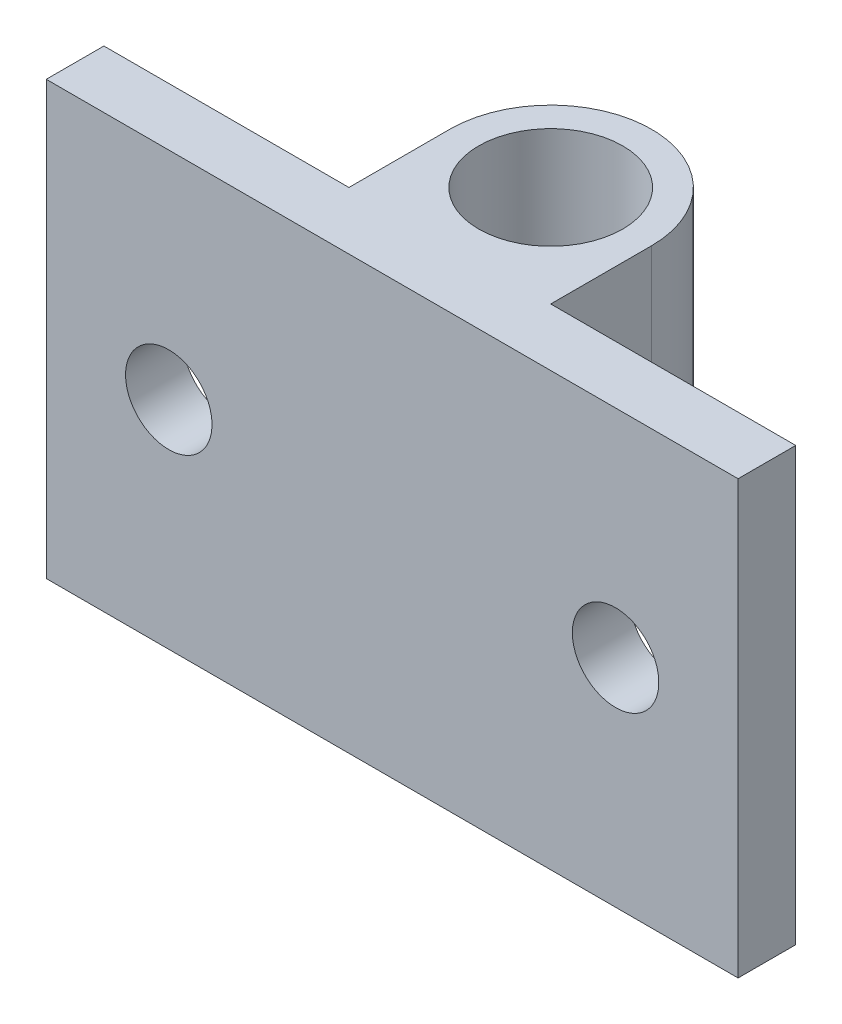
ISO-10303-21;
HEADER;
FILE_DESCRIPTION(('STEP AP214'),'2;1');
FILE_NAME('part.step','',(''),(''),'','','');
FILE_SCHEMA(('AUTOMOTIVE_DESIGN { 1 0 10303 214 1 1 1 1 }'));
ENDSEC;
DATA;
#1=APPLICATION_CONTEXT('core data for automotive mechanical design processes');
#2=APPLICATION_PROTOCOL_DEFINITION('international standard','automotive_design',2000,#1);
#3=PRODUCT_CONTEXT('',#1,'mechanical');
#4=PRODUCT('Part','Part','',(#3));
#5=PRODUCT_RELATED_PRODUCT_CATEGORY('part','',(#4));
#6=PRODUCT_DEFINITION_FORMATION('','',#4);
#7=PRODUCT_DEFINITION_CONTEXT('part definition',#1,'design');
#8=PRODUCT_DEFINITION('design','',#6,#7);
#9=PRODUCT_DEFINITION_SHAPE('','',#8);
#10=(LENGTH_UNIT() NAMED_UNIT(*) SI_UNIT(.MILLI.,.METRE.));
#11=(NAMED_UNIT(*) PLANE_ANGLE_UNIT() SI_UNIT($,.RADIAN.));
#12=(NAMED_UNIT(*) SI_UNIT($,.STERADIAN.) SOLID_ANGLE_UNIT());
#13=UNCERTAINTY_MEASURE_WITH_UNIT(LENGTH_MEASURE(1.E-05),#10,'distance_accuracy_value','');
#14=(GEOMETRIC_REPRESENTATION_CONTEXT(3) GLOBAL_UNCERTAINTY_ASSIGNED_CONTEXT((#13)) GLOBAL_UNIT_ASSIGNED_CONTEXT((#10,
#11,#12)) REPRESENTATION_CONTEXT('',''));
#15=CARTESIAN_POINT('',(0.,0.,0.));
#16=DIRECTION('',(0.,0.,1.));
#17=DIRECTION('',(1.,0.,0.));
#18=AXIS2_PLACEMENT_3D('',#15,#16,#17);
#19=CARTESIAN_POINT('',(0.,15.,0.));
#20=DIRECTION('',(0.,-1.,0.));
#21=DIRECTION('',(0.,0.,-1.));
#22=AXIS2_PLACEMENT_3D('',#19,#20,#21);
#23=CYLINDRICAL_SURFACE('',#22,3.5);
#24=CARTESIAN_POINT('',(0.,7.5,0.));
#25=DIRECTION('',(0.,-1.,0.));
#26=DIRECTION('',(0.,0.,-1.));
#27=AXIS2_PLACEMENT_3D('',#24,#25,#26);
#28=CIRCLE('',#27,3.5);
#29=CARTESIAN_POINT('',(3.5,7.5,0.));
#30=VERTEX_POINT('',#29);
#31=CARTESIAN_POINT('',(-3.5,7.5,0.));
#32=VERTEX_POINT('',#31);
#33=EDGE_CURVE('E169',#30,#32,#28,.F.);
#34=ORIENTED_EDGE('',*,*,#33,.T.);
#35=DIRECTION('',(0.,-1.,0.));
#36=VECTOR('',#35,1.);
#37=CARTESIAN_POINT('',(-3.5,15.,0.));
#38=LINE('',#37,#36);
#39=CARTESIAN_POINT('',(-3.5,15.,0.));
#40=VERTEX_POINT('',#39);
#41=EDGE_CURVE('E11',#40,#32,#38,.T.);
#42=ORIENTED_EDGE('',*,*,#41,.F.);
#43=CARTESIAN_POINT('',(0.,15.,0.));
#44=DIRECTION('',(0.,1.,0.));
#45=DIRECTION('',(0.,0.,1.));
#46=AXIS2_PLACEMENT_3D('',#43,#44,#45);
#47=CIRCLE('',#46,3.5);
#48=CARTESIAN_POINT('',(3.5,15.,0.));
#49=VERTEX_POINT('',#48);
#50=EDGE_CURVE('E139',#40,#49,#47,.F.);
#51=ORIENTED_EDGE('',*,*,#50,.T.);
#52=DIRECTION('',(0.,-1.,0.));
#53=VECTOR('',#52,1.);
#54=CARTESIAN_POINT('',(3.5,15.,0.));
#55=LINE('',#54,#53);
#56=EDGE_CURVE('E51',#49,#30,#55,.T.);
#57=ORIENTED_EDGE('',*,*,#56,.T.);
#58=EDGE_LOOP('',(#34,#42,#51,#57));
#59=FACE_BOUND('',#58,.T.);
#60=ADVANCED_FACE('F34',(#59),#23,.T.);
#61=CARTESIAN_POINT('',(-3.5,15.,0.));
#62=DIRECTION('',(1.,0.,0.));
#63=DIRECTION('',(0.,0.,-1.));
#64=AXIS2_PLACEMENT_3D('',#61,#62,#63);
#65=PLANE('',#64);
#66=DIRECTION('',(0.,0.,1.));
#67=VECTOR('',#66,1.);
#68=CARTESIAN_POINT('',(-3.5,7.5,-3.5));
#69=LINE('',#68,#67);
#70=CARTESIAN_POINT('',(-3.5,7.5,3.5));
#71=VERTEX_POINT('',#70);
#72=EDGE_CURVE('E163',#32,#71,#69,.T.);
#73=ORIENTED_EDGE('',*,*,#72,.T.);
#74=DIRECTION('',(0.,-1.,0.));
#75=VECTOR('',#74,1.);
#76=CARTESIAN_POINT('',(-3.5,15.,3.5));
#77=LINE('',#76,#75);
#78=CARTESIAN_POINT('',(-3.5,15.,3.5));
#79=VERTEX_POINT('',#78);
#80=EDGE_CURVE('E43',#79,#71,#77,.T.);
#81=ORIENTED_EDGE('',*,*,#80,.F.);
#82=DIRECTION('',(0.,0.,1.));
#83=VECTOR('',#82,1.);
#84=CARTESIAN_POINT('',(-3.5,15.,0.));
#85=LINE('',#84,#83);
#86=EDGE_CURVE('E161',#40,#79,#85,.T.);
#87=ORIENTED_EDGE('',*,*,#86,.F.);
#88=ORIENTED_EDGE('',*,*,#41,.T.);
#89=EDGE_LOOP('',(#73,#81,#87,#88));
#90=FACE_BOUND('',#89,.T.);
#91=ADVANCED_FACE('F160',(#90),#65,.F.);
#92=CARTESIAN_POINT('',(3.5,15.,0.));
#93=DIRECTION('',(1.,0.,0.));
#94=DIRECTION('',(0.,0.,-1.));
#95=AXIS2_PLACEMENT_3D('',#92,#93,#94);
#96=PLANE('',#95);
#97=DIRECTION('',(0.,-1.,0.));
#98=VECTOR('',#97,1.);
#99=CARTESIAN_POINT('',(3.5,15.,3.5));
#100=LINE('',#99,#98);
#101=CARTESIAN_POINT('',(3.5,15.,3.5));
#102=VERTEX_POINT('',#101);
#103=CARTESIAN_POINT('',(3.5,7.5,3.5));
#104=VERTEX_POINT('',#103);
#105=EDGE_CURVE('E117',#102,#104,#100,.T.);
#106=ORIENTED_EDGE('',*,*,#105,.T.);
#107=DIRECTION('',(0.,0.,1.));
#108=VECTOR('',#107,1.);
#109=CARTESIAN_POINT('',(3.5,7.5,-3.5));
#110=LINE('',#109,#108);
#111=EDGE_CURVE('E166',#30,#104,#110,.T.);
#112=ORIENTED_EDGE('',*,*,#111,.F.);
#113=ORIENTED_EDGE('',*,*,#56,.F.);
#114=DIRECTION('',(0.,0.,1.));
#115=VECTOR('',#114,1.);
#116=CARTESIAN_POINT('',(3.5,15.,0.));
#117=LINE('',#116,#115);
#118=EDGE_CURVE('E123',#49,#102,#117,.T.);
#119=ORIENTED_EDGE('',*,*,#118,.T.);
#120=EDGE_LOOP('',(#106,#112,#113,#119));
#121=FACE_BOUND('',#120,.T.);
#122=ADVANCED_FACE('F205',(#121),#96,.T.);
#123=CARTESIAN_POINT('',(0.,15.,0.));
#124=DIRECTION('',(0.,-1.,0.));
#125=DIRECTION('',(0.,0.,-1.));
#126=AXIS2_PLACEMENT_3D('',#123,#124,#125);
#127=CYLINDRICAL_SURFACE('',#126,2.5);
#128=CARTESIAN_POINT('',(0.,15.,0.));
#129=DIRECTION('',(0.,1.,0.));
#130=DIRECTION('',(0.,0.,1.));
#131=AXIS2_PLACEMENT_3D('',#128,#129,#130);
#132=CIRCLE('',#131,2.5);
#133=CARTESIAN_POINT('',(0.,15.,2.5));
#134=VERTEX_POINT('',#133);
#135=EDGE_CURVE('E125',#134,#134,#132,.T.);
#136=ORIENTED_EDGE('',*,*,#135,.T.);
#137=EDGE_LOOP('',(#136));
#138=FACE_BOUND('',#137,.T.);
#139=CARTESIAN_POINT('',(0.,7.5,0.));
#140=DIRECTION('',(0.,-1.,0.));
#141=DIRECTION('',(0.,0.,-1.));
#142=AXIS2_PLACEMENT_3D('',#139,#140,#141);
#143=CIRCLE('',#142,2.5);
#144=CARTESIAN_POINT('',(0.,7.5,-2.5));
#145=VERTEX_POINT('',#144);
#146=EDGE_CURVE('E37',#145,#145,#143,.T.);
#147=ORIENTED_EDGE('',*,*,#146,.T.);
#148=EDGE_LOOP('',(#147));
#149=FACE_BOUND('',#148,.T.);
#150=ADVANCED_FACE('F197',(#138,#149),#127,.F.);
#151=CARTESIAN_POINT('',(0.,0.,0.));
#152=DIRECTION('',(0.,1.,0.));
#153=DIRECTION('',(0.,0.,1.));
#154=AXIS2_PLACEMENT_3D('',#151,#152,#153);
#155=PLANE('',#154);
#156=DIRECTION('',(0.,0.,-1.));
#157=VECTOR('',#156,1.);
#158=CARTESIAN_POINT('',(-12.,0.,0.));
#159=LINE('',#158,#157);
#160=CARTESIAN_POINT('',(-12.,0.,5.5));
#161=VERTEX_POINT('',#160);
#162=CARTESIAN_POINT('',(-12.,0.,3.5));
#163=VERTEX_POINT('',#162);
#164=EDGE_CURVE('E131',#161,#163,#159,.T.);
#165=ORIENTED_EDGE('',*,*,#164,.T.);
#166=DIRECTION('',(-1.,0.,0.));
#167=VECTOR('',#166,1.);
#168=CARTESIAN_POINT('',(0.,0.,3.5));
#169=LINE('',#168,#167);
#170=CARTESIAN_POINT('',(12.,0.,3.5));
#171=VERTEX_POINT('',#170);
#172=EDGE_CURVE('E137',#171,#163,#169,.T.);
#173=ORIENTED_EDGE('',*,*,#172,.F.);
#174=DIRECTION('',(0.,0.,-1.));
#175=VECTOR('',#174,1.);
#176=CARTESIAN_POINT('',(12.,0.,0.));
#177=LINE('',#176,#175);
#178=CARTESIAN_POINT('',(12.,0.,5.5));
#179=VERTEX_POINT('',#178);
#180=EDGE_CURVE('E76',#179,#171,#177,.T.);
#181=ORIENTED_EDGE('',*,*,#180,.F.);
#182=DIRECTION('',(1.,0.,0.));
#183=VECTOR('',#182,1.);
#184=CARTESIAN_POINT('',(0.,0.,5.5));
#185=LINE('',#184,#183);
#186=EDGE_CURVE('E69',#161,#179,#185,.T.);
#187=ORIENTED_EDGE('',*,*,#186,.F.);
#188=EDGE_LOOP('',(#165,#173,#181,#187));
#189=FACE_BOUND('',#188,.T.);
#190=ADVANCED_FACE('F195',(#189),#155,.F.);
#191=CARTESIAN_POINT('',(-12.,15.,0.));
#192=DIRECTION('',(-1.,0.,0.));
#193=DIRECTION('',(0.,0.,1.));
#194=AXIS2_PLACEMENT_3D('',#191,#192,#193);
#195=PLANE('',#194);
#196=ORIENTED_EDGE('',*,*,#164,.F.);
#197=DIRECTION('',(0.,-1.,0.));
#198=VECTOR('',#197,1.);
#199=CARTESIAN_POINT('',(-12.,15.,5.5));
#200=LINE('',#199,#198);
#201=CARTESIAN_POINT('',(-12.,15.,5.5));
#202=VERTEX_POINT('',#201);
#203=EDGE_CURVE('E143',#202,#161,#200,.T.);
#204=ORIENTED_EDGE('',*,*,#203,.F.);
#205=DIRECTION('',(0.,0.,-1.));
#206=VECTOR('',#205,1.);
#207=CARTESIAN_POINT('',(-12.,15.,0.));
#208=LINE('',#207,#206);
#209=CARTESIAN_POINT('',(-12.,15.,3.5));
#210=VERTEX_POINT('',#209);
#211=EDGE_CURVE('E189',#202,#210,#208,.T.);
#212=ORIENTED_EDGE('',*,*,#211,.T.);
#213=DIRECTION('',(0.,-1.,0.));
#214=VECTOR('',#213,1.);
#215=CARTESIAN_POINT('',(-12.,15.,3.5));
#216=LINE('',#215,#214);
#217=EDGE_CURVE('E145',#210,#163,#216,.T.);
#218=ORIENTED_EDGE('',*,*,#217,.T.);
#219=EDGE_LOOP('',(#196,#204,#212,#218));
#220=FACE_BOUND('',#219,.T.);
#221=ADVANCED_FACE('F193',(#220),#195,.T.);
#222=CARTESIAN_POINT('',(0.,15.,5.5));
#223=DIRECTION('',(0.,0.,-1.));
#224=DIRECTION('',(-1.,0.,0.));
#225=AXIS2_PLACEMENT_3D('',#222,#223,#224);
#226=PLANE('',#225);
#227=CARTESIAN_POINT('',(7.75,7.5,5.50000000000001));
#228=DIRECTION('',(0.,0.,-1.));
#229=DIRECTION('',(-1.,0.,0.));
#230=AXIS2_PLACEMENT_3D('',#227,#228,#229);
#231=CIRCLE('',#230,1.5);
#232=CARTESIAN_POINT('',(6.25,7.5,5.50000000000001));
#233=VERTEX_POINT('',#232);
#234=EDGE_CURVE('E134',#233,#233,#231,.T.);
#235=ORIENTED_EDGE('',*,*,#234,.T.);
#236=EDGE_LOOP('',(#235));
#237=FACE_BOUND('',#236,.T.);
#238=CARTESIAN_POINT('',(-7.75,7.5,5.5));
#239=DIRECTION('',(0.,0.,-1.));
#240=DIRECTION('',(-1.,0.,0.));
#241=AXIS2_PLACEMENT_3D('',#238,#239,#240);
#242=CIRCLE('',#241,1.5);
#243=CARTESIAN_POINT('',(-9.25,7.5,5.5));
#244=VERTEX_POINT('',#243);
#245=EDGE_CURVE('E181',#244,#244,#242,.T.);
#246=ORIENTED_EDGE('',*,*,#245,.T.);
#247=EDGE_LOOP('',(#246));
#248=FACE_BOUND('',#247,.T.);
#249=ORIENTED_EDGE('',*,*,#186,.T.);
#250=DIRECTION('',(0.,-1.,0.));
#251=VECTOR('',#250,1.);
#252=CARTESIAN_POINT('',(12.,15.,5.5));
#253=LINE('',#252,#251);
#254=CARTESIAN_POINT('',(12.,15.,5.5));
#255=VERTEX_POINT('',#254);
#256=EDGE_CURVE('E116',#255,#179,#253,.T.);
#257=ORIENTED_EDGE('',*,*,#256,.F.);
#258=DIRECTION('',(1.,0.,0.));
#259=VECTOR('',#258,1.);
#260=CARTESIAN_POINT('',(0.,15.,5.5));
#261=LINE('',#260,#259);
#262=EDGE_CURVE('E110',#202,#255,#261,.T.);
#263=ORIENTED_EDGE('',*,*,#262,.F.);
#264=ORIENTED_EDGE('',*,*,#203,.T.);
#265=EDGE_LOOP('',(#249,#257,#263,#264));
#266=FACE_BOUND('',#265,.T.);
#267=ADVANCED_FACE('F203',(#237,#248,#266),#226,.F.);
#268=CARTESIAN_POINT('',(12.,15.,0.));
#269=DIRECTION('',(-1.,0.,0.));
#270=DIRECTION('',(0.,0.,1.));
#271=AXIS2_PLACEMENT_3D('',#268,#269,#270);
#272=PLANE('',#271);
#273=ORIENTED_EDGE('',*,*,#180,.T.);
#274=DIRECTION('',(0.,-1.,0.));
#275=VECTOR('',#274,1.);
#276=CARTESIAN_POINT('',(12.,15.,3.5));
#277=LINE('',#276,#275);
#278=CARTESIAN_POINT('',(12.,15.,3.5));
#279=VERTEX_POINT('',#278);
#280=EDGE_CURVE('E112',#279,#171,#277,.T.);
#281=ORIENTED_EDGE('',*,*,#280,.F.);
#282=DIRECTION('',(0.,0.,-1.));
#283=VECTOR('',#282,1.);
#284=CARTESIAN_POINT('',(12.,15.,0.));
#285=LINE('',#284,#283);
#286=EDGE_CURVE('E100',#255,#279,#285,.T.);
#287=ORIENTED_EDGE('',*,*,#286,.F.);
#288=ORIENTED_EDGE('',*,*,#256,.T.);
#289=EDGE_LOOP('',(#273,#281,#287,#288));
#290=FACE_BOUND('',#289,.T.);
#291=ADVANCED_FACE('F113',(#290),#272,.F.);
#292=CARTESIAN_POINT('',(0.,15.,3.5));
#293=DIRECTION('',(0.,0.,1.));
#294=DIRECTION('',(1.,0.,0.));
#295=AXIS2_PLACEMENT_3D('',#292,#293,#294);
#296=PLANE('',#295);
#297=CARTESIAN_POINT('',(7.75,7.5,3.50000000000001));
#298=DIRECTION('',(0.,0.,-1.));
#299=DIRECTION('',(-1.,0.,0.));
#300=AXIS2_PLACEMENT_3D('',#297,#298,#299);
#301=CIRCLE('',#300,1.5);
#302=CARTESIAN_POINT('',(6.25,7.5,3.50000000000001));
#303=VERTEX_POINT('',#302);
#304=EDGE_CURVE('E178',#303,#303,#301,.T.);
#305=ORIENTED_EDGE('',*,*,#304,.F.);
#306=EDGE_LOOP('',(#305));
#307=FACE_BOUND('',#306,.T.);
#308=ORIENTED_EDGE('',*,*,#172,.T.);
#309=ORIENTED_EDGE('',*,*,#217,.F.);
#310=DIRECTION('',(-1.,0.,0.));
#311=VECTOR('',#310,1.);
#312=CARTESIAN_POINT('',(0.,15.,3.5));
#313=LINE('',#312,#311);
#314=EDGE_CURVE('E156',#79,#210,#313,.T.);
#315=ORIENTED_EDGE('',*,*,#314,.F.);
#316=ORIENTED_EDGE('',*,*,#80,.T.);
#317=DIRECTION('',(1.,0.,0.));
#318=VECTOR('',#317,1.);
#319=CARTESIAN_POINT('',(-3.5,7.5,3.5));
#320=LINE('',#319,#318);
#321=EDGE_CURVE('E154',#71,#104,#320,.T.);
#322=ORIENTED_EDGE('',*,*,#321,.T.);
#323=ORIENTED_EDGE('',*,*,#105,.F.);
#324=DIRECTION('',(-1.,0.,0.));
#325=VECTOR('',#324,1.);
#326=CARTESIAN_POINT('',(0.,15.,3.5));
#327=LINE('',#326,#325);
#328=EDGE_CURVE('E106',#279,#102,#327,.T.);
#329=ORIENTED_EDGE('',*,*,#328,.F.);
#330=ORIENTED_EDGE('',*,*,#280,.T.);
#331=EDGE_LOOP('',(#308,#309,#315,#316,#322,#323,#329,#330));
#332=FACE_BOUND('',#331,.T.);
#333=CARTESIAN_POINT('',(-7.75,7.5,3.5));
#334=DIRECTION('',(0.,0.,-1.));
#335=DIRECTION('',(-1.,0.,0.));
#336=AXIS2_PLACEMENT_3D('',#333,#334,#335);
#337=CIRCLE('',#336,1.5);
#338=CARTESIAN_POINT('',(-9.25,7.5,3.5));
#339=VERTEX_POINT('',#338);
#340=EDGE_CURVE('E175',#339,#339,#337,.T.);
#341=ORIENTED_EDGE('',*,*,#340,.F.);
#342=EDGE_LOOP('',(#341));
#343=FACE_BOUND('',#342,.T.);
#344=ADVANCED_FACE('F119',(#307,#332,#343),#296,.F.);
#345=CARTESIAN_POINT('',(0.,15.,0.));
#346=DIRECTION('',(0.,1.,0.));
#347=DIRECTION('',(0.,0.,1.));
#348=AXIS2_PLACEMENT_3D('',#345,#346,#347);
#349=PLANE('',#348);
#350=ORIENTED_EDGE('',*,*,#50,.F.);
#351=ORIENTED_EDGE('',*,*,#86,.T.);
#352=ORIENTED_EDGE('',*,*,#314,.T.);
#353=ORIENTED_EDGE('',*,*,#211,.F.);
#354=ORIENTED_EDGE('',*,*,#262,.T.);
#355=ORIENTED_EDGE('',*,*,#286,.T.);
#356=ORIENTED_EDGE('',*,*,#328,.T.);
#357=ORIENTED_EDGE('',*,*,#118,.F.);
#358=EDGE_LOOP('',(#350,#351,#352,#353,#354,#355,#356,#357));
#359=FACE_BOUND('',#358,.T.);
#360=ORIENTED_EDGE('',*,*,#135,.F.);
#361=EDGE_LOOP('',(#360));
#362=FACE_BOUND('',#361,.T.);
#363=ADVANCED_FACE('F102',(#359,#362),#349,.T.);
#364=CARTESIAN_POINT('',(7.75,7.5,5.50000000000001));
#365=DIRECTION('',(0.,0.,-1.));
#366=DIRECTION('',(-1.,0.,0.));
#367=AXIS2_PLACEMENT_3D('',#364,#365,#366);
#368=CYLINDRICAL_SURFACE('',#367,1.5);
#369=ORIENTED_EDGE('',*,*,#234,.F.);
#370=EDGE_LOOP('',(#369));
#371=FACE_BOUND('',#370,.T.);
#372=ORIENTED_EDGE('',*,*,#304,.T.);
#373=EDGE_LOOP('',(#372));
#374=FACE_BOUND('',#373,.T.);
#375=ADVANCED_FACE('F237',(#371,#374),#368,.F.);
#376=CARTESIAN_POINT('',(-7.75,7.5,5.5));
#377=DIRECTION('',(0.,0.,-1.));
#378=DIRECTION('',(-1.,0.,0.));
#379=AXIS2_PLACEMENT_3D('',#376,#377,#378);
#380=CYLINDRICAL_SURFACE('',#379,1.5);
#381=ORIENTED_EDGE('',*,*,#245,.F.);
#382=EDGE_LOOP('',(#381));
#383=FACE_BOUND('',#382,.T.);
#384=ORIENTED_EDGE('',*,*,#340,.T.);
#385=EDGE_LOOP('',(#384));
#386=FACE_BOUND('',#385,.T.);
#387=ADVANCED_FACE('F234',(#383,#386),#380,.F.);
#388=CARTESIAN_POINT('',(-3.5,7.5,-3.5));
#389=DIRECTION('',(0.,-1.,0.));
#390=DIRECTION('',(0.,0.,-1.));
#391=AXIS2_PLACEMENT_3D('',#388,#389,#390);
#392=PLANE('',#391);
#393=ORIENTED_EDGE('',*,*,#146,.F.);
#394=EDGE_LOOP('',(#393));
#395=FACE_BOUND('',#394,.T.);
#396=ORIENTED_EDGE('',*,*,#33,.F.);
#397=ORIENTED_EDGE('',*,*,#111,.T.);
#398=ORIENTED_EDGE('',*,*,#321,.F.);
#399=ORIENTED_EDGE('',*,*,#72,.F.);
#400=EDGE_LOOP('',(#396,#397,#398,#399));
#401=FACE_BOUND('',#400,.T.);
#402=ADVANCED_FACE('F214',(#395,#401),#392,.T.);
#403=CLOSED_SHELL('',(#60,#91,#122,#150,#190,#221,#267,#291,#344,#363,#375,#387,#402));
#404=MANIFOLD_SOLID_BREP('B2',#403);
#405=ADVANCED_BREP_SHAPE_REPRESENTATION('',(#18,#404),#14);
#406=SHAPE_DEFINITION_REPRESENTATION(#9,#405);
ENDSEC;
END-ISO-10303-21;
